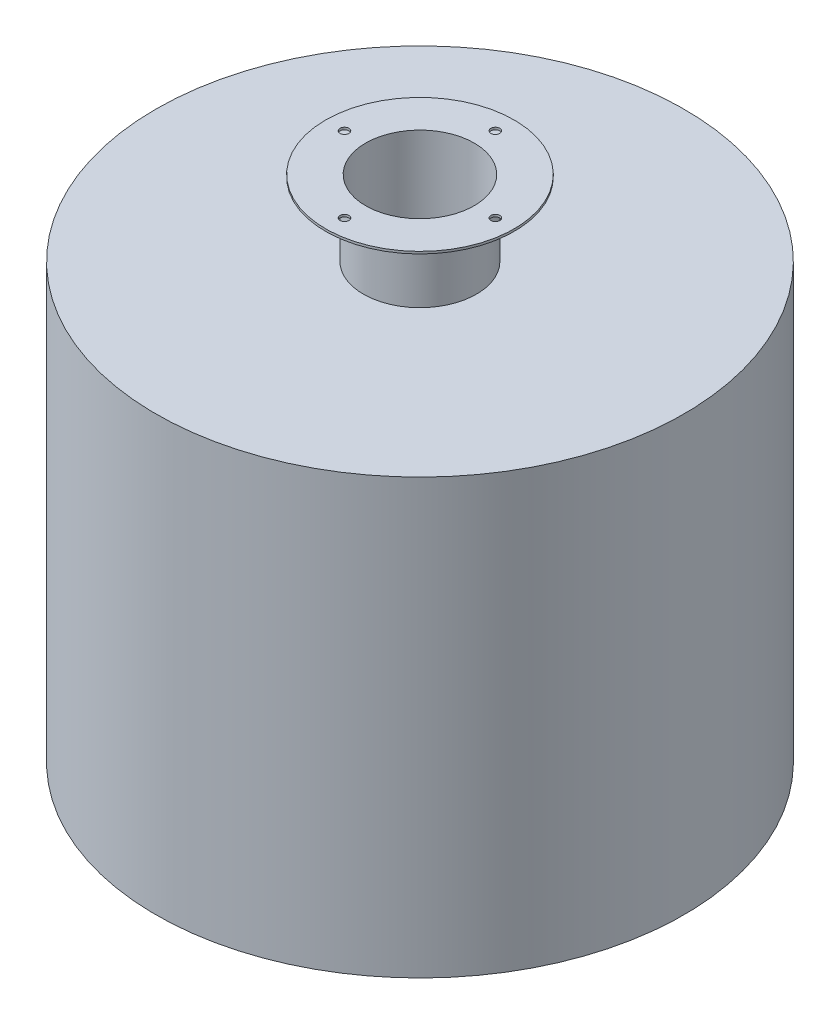
ISO-10303-21;
HEADER;
FILE_DESCRIPTION(('STEP AP214'),'2;1');
FILE_NAME('part.step','',(''),(''),'','','');
FILE_SCHEMA(('AUTOMOTIVE_DESIGN { 1 0 10303 214 1 1 1 1 }'));
ENDSEC;
DATA;
#1=APPLICATION_CONTEXT('core data for automotive mechanical design processes');
#2=APPLICATION_PROTOCOL_DEFINITION('international standard','automotive_design',2000,#1);
#3=PRODUCT_CONTEXT('',#1,'mechanical');
#4=PRODUCT('Part','Part','',(#3));
#5=PRODUCT_RELATED_PRODUCT_CATEGORY('part','',(#4));
#6=PRODUCT_DEFINITION_FORMATION('','',#4);
#7=PRODUCT_DEFINITION_CONTEXT('part definition',#1,'design');
#8=PRODUCT_DEFINITION('design','',#6,#7);
#9=PRODUCT_DEFINITION_SHAPE('','',#8);
#10=(LENGTH_UNIT() NAMED_UNIT(*) SI_UNIT(.MILLI.,.METRE.));
#11=(NAMED_UNIT(*) PLANE_ANGLE_UNIT() SI_UNIT($,.RADIAN.));
#12=(NAMED_UNIT(*) SI_UNIT($,.STERADIAN.) SOLID_ANGLE_UNIT());
#13=UNCERTAINTY_MEASURE_WITH_UNIT(LENGTH_MEASURE(1.E-05),#10,'distance_accuracy_value','');
#14=(GEOMETRIC_REPRESENTATION_CONTEXT(3) GLOBAL_UNCERTAINTY_ASSIGNED_CONTEXT((#13)) GLOBAL_UNIT_ASSIGNED_CONTEXT((#10,
#11,#12)) REPRESENTATION_CONTEXT('',''));
#15=CARTESIAN_POINT('',(0.,0.,0.));
#16=DIRECTION('',(0.,0.,1.));
#17=DIRECTION('',(1.,0.,0.));
#18=AXIS2_PLACEMENT_3D('',#15,#16,#17);
#19=CARTESIAN_POINT('',(0.,0.,0.));
#20=DIRECTION('',(0.,1.,0.));
#21=DIRECTION('',(-1.,0.,0.));
#22=AXIS2_PLACEMENT_3D('',#19,#20,#21);
#23=PLANE('',#22);
#24=CARTESIAN_POINT('',(0.,0.,0.));
#25=DIRECTION('',(0.,1.,0.));
#26=DIRECTION('',(-1.,0.,0.));
#27=AXIS2_PLACEMENT_3D('',#24,#25,#26);
#28=CIRCLE('',#27,177.8);
#29=CARTESIAN_POINT('',(-177.8,0.,0.));
#30=VERTEX_POINT('',#29);
#31=EDGE_CURVE('E10',#30,#30,#28,.T.);
#32=ORIENTED_EDGE('',*,*,#31,.F.);
#33=EDGE_LOOP('',(#32));
#34=FACE_BOUND('',#33,.T.);
#35=ADVANCED_FACE('F40',(#34),#23,.F.);
#36=CARTESIAN_POINT('',(0.,342.9,0.));
#37=DIRECTION('',(0.,1.,0.));
#38=DIRECTION('',(-1.,0.,0.));
#39=AXIS2_PLACEMENT_3D('',#36,#37,#38);
#40=CYLINDRICAL_SURFACE('',#39,177.8);
#41=CARTESIAN_POINT('',(0.,292.1,0.));
#42=DIRECTION('',(0.,1.,0.));
#43=DIRECTION('',(-1.,0.,0.));
#44=AXIS2_PLACEMENT_3D('',#41,#42,#43);
#45=CIRCLE('',#44,177.8);
#46=CARTESIAN_POINT('',(-177.8,292.1,0.));
#47=VERTEX_POINT('',#46);
#48=EDGE_CURVE('E47',#47,#47,#45,.T.);
#49=ORIENTED_EDGE('',*,*,#48,.F.);
#50=EDGE_LOOP('',(#49));
#51=FACE_BOUND('',#50,.T.);
#52=ORIENTED_EDGE('',*,*,#31,.T.);
#53=EDGE_LOOP('',(#52));
#54=FACE_BOUND('',#53,.T.);
#55=ADVANCED_FACE('F162',(#51,#54),#40,.T.);
#56=CARTESIAN_POINT('',(177.8,292.1,0.));
#57=DIRECTION('',(0.,-1.,0.));
#58=DIRECTION('',(1.,0.,0.));
#59=AXIS2_PLACEMENT_3D('',#56,#57,#58);
#60=PLANE('',#59);
#61=CARTESIAN_POINT('',(0.,292.1,0.));
#62=DIRECTION('',(0.,1.,0.));
#63=DIRECTION('',(-1.,0.,0.));
#64=AXIS2_PLACEMENT_3D('',#61,#62,#63);
#65=CIRCLE('',#64,38.1);
#66=CARTESIAN_POINT('',(-38.1,292.1,0.));
#67=VERTEX_POINT('',#66);
#68=EDGE_CURVE('E53',#67,#67,#65,.T.);
#69=ORIENTED_EDGE('',*,*,#68,.F.);
#70=EDGE_LOOP('',(#69));
#71=FACE_BOUND('',#70,.T.);
#72=ORIENTED_EDGE('',*,*,#48,.T.);
#73=EDGE_LOOP('',(#72));
#74=FACE_BOUND('',#73,.T.);
#75=ADVANCED_FACE('F157',(#71,#74),#60,.F.);
#76=CARTESIAN_POINT('',(0.,342.9,0.));
#77=DIRECTION('',(0.,1.,0.));
#78=DIRECTION('',(-1.,0.,0.));
#79=AXIS2_PLACEMENT_3D('',#76,#77,#78);
#80=CYLINDRICAL_SURFACE('',#79,38.1);
#81=CARTESIAN_POINT('',(0.,341.376,0.));
#82=DIRECTION('',(0.,1.,0.));
#83=DIRECTION('',(-1.,0.,0.));
#84=AXIS2_PLACEMENT_3D('',#81,#82,#83);
#85=CIRCLE('',#84,38.1);
#86=CARTESIAN_POINT('',(-38.1,341.376,0.));
#87=VERTEX_POINT('',#86);
#88=EDGE_CURVE('E59',#87,#87,#85,.T.);
#89=ORIENTED_EDGE('',*,*,#88,.F.);
#90=EDGE_LOOP('',(#89));
#91=FACE_BOUND('',#90,.T.);
#92=ORIENTED_EDGE('',*,*,#68,.T.);
#93=EDGE_LOOP('',(#92));
#94=FACE_BOUND('',#93,.T.);
#95=ADVANCED_FACE('F150',(#91,#94),#80,.T.);
#96=CARTESIAN_POINT('',(38.1,341.376,0.));
#97=DIRECTION('',(0.,1.,0.));
#98=DIRECTION('',(-1.,0.,0.));
#99=AXIS2_PLACEMENT_3D('',#96,#97,#98);
#100=PLANE('',#99);
#101=CARTESIAN_POINT('',(-1.76501617226847E-13,341.376,-50.8));
#102=DIRECTION('',(0.,1.,0.));
#103=DIRECTION('',(-1.,0.,0.));
#104=AXIS2_PLACEMENT_3D('',#101,#102,#103);
#105=CIRCLE('',#104,2.999994);
#106=CARTESIAN_POINT('',(-2.99999400000017,341.376,-50.8));
#107=VERTEX_POINT('',#106);
#108=EDGE_CURVE('E97',#107,#107,#105,.F.);
#109=ORIENTED_EDGE('',*,*,#108,.F.);
#110=EDGE_LOOP('',(#109));
#111=FACE_BOUND('',#110,.T.);
#112=CARTESIAN_POINT('',(-50.8,341.376,0.));
#113=DIRECTION('',(0.,1.,0.));
#114=DIRECTION('',(-1.,0.,0.));
#115=AXIS2_PLACEMENT_3D('',#112,#113,#114);
#116=CIRCLE('',#115,2.999994);
#117=CARTESIAN_POINT('',(-53.799994,341.376,0.));
#118=VERTEX_POINT('',#117);
#119=EDGE_CURVE('E107',#118,#118,#116,.F.);
#120=ORIENTED_EDGE('',*,*,#119,.F.);
#121=EDGE_LOOP('',(#120));
#122=FACE_BOUND('',#121,.T.);
#123=CARTESIAN_POINT('',(5.32967390826077E-13,341.376,50.8));
#124=DIRECTION('',(0.,1.,0.));
#125=DIRECTION('',(-1.,0.,0.));
#126=AXIS2_PLACEMENT_3D('',#123,#124,#125);
#127=CIRCLE('',#126,2.999994);
#128=CARTESIAN_POINT('',(-2.99999399999946,341.376,50.8));
#129=VERTEX_POINT('',#128);
#130=EDGE_CURVE('E98',#129,#129,#127,.F.);
#131=ORIENTED_EDGE('',*,*,#130,.F.);
#132=EDGE_LOOP('',(#131));
#133=FACE_BOUND('',#132,.T.);
#134=CARTESIAN_POINT('',(50.8,341.376,0.));
#135=DIRECTION('',(0.,1.,0.));
#136=DIRECTION('',(-1.,0.,0.));
#137=AXIS2_PLACEMENT_3D('',#134,#135,#136);
#138=CIRCLE('',#137,2.999994);
#139=CARTESIAN_POINT('',(47.800006,341.376,0.));
#140=VERTEX_POINT('',#139);
#141=EDGE_CURVE('E79',#140,#140,#138,.F.);
#142=ORIENTED_EDGE('',*,*,#141,.F.);
#143=EDGE_LOOP('',(#142));
#144=FACE_BOUND('',#143,.T.);
#145=CARTESIAN_POINT('',(0.,341.376,0.));
#146=DIRECTION('',(0.,1.,0.));
#147=DIRECTION('',(-1.,0.,0.));
#148=AXIS2_PLACEMENT_3D('',#145,#146,#147);
#149=CIRCLE('',#148,63.5);
#150=CARTESIAN_POINT('',(-63.5,341.376,0.));
#151=VERTEX_POINT('',#150);
#152=EDGE_CURVE('E65',#151,#151,#149,.T.);
#153=ORIENTED_EDGE('',*,*,#152,.F.);
#154=EDGE_LOOP('',(#153));
#155=FACE_BOUND('',#154,.T.);
#156=ORIENTED_EDGE('',*,*,#88,.T.);
#157=EDGE_LOOP('',(#156));
#158=FACE_BOUND('',#157,.T.);
#159=ADVANCED_FACE('F144',(#111,#122,#133,#144,#155,#158),#100,.F.);
#160=CARTESIAN_POINT('',(0.,342.9,0.));
#161=DIRECTION('',(0.,1.,0.));
#162=DIRECTION('',(-1.,0.,0.));
#163=AXIS2_PLACEMENT_3D('',#160,#161,#162);
#164=CYLINDRICAL_SURFACE('',#163,63.5);
#165=CARTESIAN_POINT('',(0.,342.9,0.));
#166=DIRECTION('',(0.,1.,0.));
#167=DIRECTION('',(-1.,0.,0.));
#168=AXIS2_PLACEMENT_3D('',#165,#166,#167);
#169=CIRCLE('',#168,63.5);
#170=CARTESIAN_POINT('',(-63.5,342.9,0.));
#171=VERTEX_POINT('',#170);
#172=EDGE_CURVE('E69',#171,#171,#169,.T.);
#173=ORIENTED_EDGE('',*,*,#172,.F.);
#174=EDGE_LOOP('',(#173));
#175=FACE_BOUND('',#174,.T.);
#176=ORIENTED_EDGE('',*,*,#152,.T.);
#177=EDGE_LOOP('',(#176));
#178=FACE_BOUND('',#177,.T.);
#179=ADVANCED_FACE('F130',(#175,#178),#164,.T.);
#180=CARTESIAN_POINT('',(63.5,342.9,0.));
#181=DIRECTION('',(0.,-1.,0.));
#182=DIRECTION('',(1.,0.,0.));
#183=AXIS2_PLACEMENT_3D('',#180,#181,#182);
#184=PLANE('',#183);
#185=CARTESIAN_POINT('',(-1.76497752785837E-13,342.9,-50.8));
#186=DIRECTION('',(0.,1.,0.));
#187=DIRECTION('',(0.,0.,1.));
#188=AXIS2_PLACEMENT_3D('',#185,#186,#187);
#189=CIRCLE('',#188,2.999994);
#190=CARTESIAN_POINT('',(-1.66023329718195E-13,342.9,-47.800006));
#191=VERTEX_POINT('',#190);
#192=EDGE_CURVE('E111',#191,#191,#189,.T.);
#193=ORIENTED_EDGE('',*,*,#192,.F.);
#194=EDGE_LOOP('',(#193));
#195=FACE_BOUND('',#194,.T.);
#196=CARTESIAN_POINT('',(-50.8,342.9,0.));
#197=DIRECTION('',(0.,1.,0.));
#198=DIRECTION('',(1.,0.,0.));
#199=AXIS2_PLACEMENT_3D('',#196,#197,#198);
#200=CIRCLE('',#199,2.999994);
#201=CARTESIAN_POINT('',(-47.800006,342.9,0.));
#202=VERTEX_POINT('',#201);
#203=EDGE_CURVE('E102',#202,#202,#200,.T.);
#204=ORIENTED_EDGE('',*,*,#203,.F.);
#205=EDGE_LOOP('',(#204));
#206=FACE_BOUND('',#205,.T.);
#207=CARTESIAN_POINT('',(5.32971255267088E-13,342.9,50.8));
#208=DIRECTION('',(0.,1.,0.));
#209=DIRECTION('',(0.,0.,-1.));
#210=AXIS2_PLACEMENT_3D('',#207,#208,#209);
#211=CIRCLE('',#210,2.999994);
#212=CARTESIAN_POINT('',(5.01547986064164E-13,342.9,47.800006));
#213=VERTEX_POINT('',#212);
#214=EDGE_CURVE('E103',#213,#213,#211,.T.);
#215=ORIENTED_EDGE('',*,*,#214,.F.);
#216=EDGE_LOOP('',(#215));
#217=FACE_BOUND('',#216,.T.);
#218=CARTESIAN_POINT('',(50.8,342.9,0.));
#219=DIRECTION('',(0.,1.,0.));
#220=DIRECTION('',(-1.,0.,0.));
#221=AXIS2_PLACEMENT_3D('',#218,#219,#220);
#222=CIRCLE('',#221,2.999994);
#223=CARTESIAN_POINT('',(47.800006,342.9,0.));
#224=VERTEX_POINT('',#223);
#225=EDGE_CURVE('E93',#224,#224,#222,.T.);
#226=ORIENTED_EDGE('',*,*,#225,.F.);
#227=EDGE_LOOP('',(#226));
#228=FACE_BOUND('',#227,.T.);
#229=CARTESIAN_POINT('',(0.,342.9,0.));
#230=DIRECTION('',(0.,1.,0.));
#231=DIRECTION('',(-1.,0.,0.));
#232=AXIS2_PLACEMENT_3D('',#229,#230,#231);
#233=CIRCLE('',#232,36.576);
#234=CARTESIAN_POINT('',(-36.576,342.9,0.));
#235=VERTEX_POINT('',#234);
#236=EDGE_CURVE('E74',#235,#235,#233,.T.);
#237=ORIENTED_EDGE('',*,*,#236,.F.);
#238=EDGE_LOOP('',(#237));
#239=FACE_BOUND('',#238,.T.);
#240=ORIENTED_EDGE('',*,*,#172,.T.);
#241=EDGE_LOOP('',(#240));
#242=FACE_BOUND('',#241,.T.);
#243=ADVANCED_FACE('F126',(#195,#206,#217,#228,#239,#242),#184,.F.);
#244=CARTESIAN_POINT('',(0.,1.524,0.));
#245=DIRECTION('',(0.,1.,0.));
#246=DIRECTION('',(-1.,0.,0.));
#247=AXIS2_PLACEMENT_3D('',#244,#245,#246);
#248=PLANE('',#247);
#249=CARTESIAN_POINT('',(0.,1.52400000000003,0.));
#250=DIRECTION('',(0.,1.,0.));
#251=DIRECTION('',(-1.,0.,0.));
#252=AXIS2_PLACEMENT_3D('',#249,#250,#251);
#253=CIRCLE('',#252,176.276);
#254=CARTESIAN_POINT('',(-176.276,1.52400000000003,0.));
#255=VERTEX_POINT('',#254);
#256=EDGE_CURVE('E73',#255,#255,#253,.T.);
#257=ORIENTED_EDGE('',*,*,#256,.T.);
#258=EDGE_LOOP('',(#257));
#259=FACE_BOUND('',#258,.T.);
#260=ADVANCED_FACE('F129',(#259),#248,.T.);
#261=CARTESIAN_POINT('',(0.,342.9,0.));
#262=DIRECTION('',(0.,1.,0.));
#263=DIRECTION('',(-1.,0.,0.));
#264=AXIS2_PLACEMENT_3D('',#261,#262,#263);
#265=CYLINDRICAL_SURFACE('',#264,176.276);
#266=CARTESIAN_POINT('',(0.,290.576,0.));
#267=DIRECTION('',(0.,-1.,0.));
#268=DIRECTION('',(1.,0.,0.));
#269=AXIS2_PLACEMENT_3D('',#266,#267,#268);
#270=CIRCLE('',#269,176.276);
#271=CARTESIAN_POINT('',(176.276,290.576,0.));
#272=VERTEX_POINT('',#271);
#273=EDGE_CURVE('E83',#272,#272,#270,.F.);
#274=ORIENTED_EDGE('',*,*,#273,.T.);
#275=EDGE_LOOP('',(#274));
#276=FACE_BOUND('',#275,.T.);
#277=ORIENTED_EDGE('',*,*,#256,.F.);
#278=EDGE_LOOP('',(#277));
#279=FACE_BOUND('',#278,.T.);
#280=ADVANCED_FACE('F207',(#276,#279),#265,.F.);
#281=CARTESIAN_POINT('',(177.8,290.576,0.));
#282=DIRECTION('',(0.,-1.,0.));
#283=DIRECTION('',(1.,0.,0.));
#284=AXIS2_PLACEMENT_3D('',#281,#282,#283);
#285=PLANE('',#284);
#286=CARTESIAN_POINT('',(0.,290.576,0.));
#287=DIRECTION('',(0.,-1.,0.));
#288=DIRECTION('',(1.,0.,0.));
#289=AXIS2_PLACEMENT_3D('',#286,#287,#288);
#290=CIRCLE('',#289,36.576);
#291=CARTESIAN_POINT('',(36.576,290.576,0.));
#292=VERTEX_POINT('',#291);
#293=EDGE_CURVE('E78',#292,#292,#290,.F.);
#294=ORIENTED_EDGE('',*,*,#293,.T.);
#295=EDGE_LOOP('',(#294));
#296=FACE_BOUND('',#295,.T.);
#297=ORIENTED_EDGE('',*,*,#273,.F.);
#298=EDGE_LOOP('',(#297));
#299=FACE_BOUND('',#298,.T.);
#300=ADVANCED_FACE('F218',(#296,#299),#285,.T.);
#301=CARTESIAN_POINT('',(0.,342.9,0.));
#302=DIRECTION('',(0.,1.,0.));
#303=DIRECTION('',(-1.,0.,0.));
#304=AXIS2_PLACEMENT_3D('',#301,#302,#303);
#305=CYLINDRICAL_SURFACE('',#304,36.576);
#306=ORIENTED_EDGE('',*,*,#236,.T.);
#307=EDGE_LOOP('',(#306));
#308=FACE_BOUND('',#307,.T.);
#309=ORIENTED_EDGE('',*,*,#293,.F.);
#310=EDGE_LOOP('',(#309));
#311=FACE_BOUND('',#310,.T.);
#312=ADVANCED_FACE('F229',(#308,#311),#305,.F.);
#313=CARTESIAN_POINT('',(50.8,-0.000999999999973245,0.));
#314=DIRECTION('',(0.,1.,0.));
#315=DIRECTION('',(-1.,0.,0.));
#316=AXIS2_PLACEMENT_3D('',#313,#314,#315);
#317=CYLINDRICAL_SURFACE('',#316,2.999994);
#318=ORIENTED_EDGE('',*,*,#225,.T.);
#319=EDGE_LOOP('',(#318));
#320=FACE_BOUND('',#319,.T.);
#321=ORIENTED_EDGE('',*,*,#141,.T.);
#322=EDGE_LOOP('',(#321));
#323=FACE_BOUND('',#322,.T.);
#324=ADVANCED_FACE('F240',(#320,#323),#317,.F.);
#325=CARTESIAN_POINT('',(5.32101753503971E-13,-0.000999999999973245,50.8));
#326=DIRECTION('',(0.,1.,0.));
#327=DIRECTION('',(0.,0.,1.));
#328=AXIS2_PLACEMENT_3D('',#325,#326,#327);
#329=CYLINDRICAL_SURFACE('',#328,2.999994);
#330=ORIENTED_EDGE('',*,*,#214,.T.);
#331=EDGE_LOOP('',(#330));
#332=FACE_BOUND('',#331,.T.);
#333=ORIENTED_EDGE('',*,*,#130,.T.);
#334=EDGE_LOOP('',(#333));
#335=FACE_BOUND('',#334,.T.);
#336=ADVANCED_FACE('F251',(#332,#335),#329,.F.);
#337=CARTESIAN_POINT('',(-50.8,-0.000999999999973245,0.));
#338=DIRECTION('',(0.,1.,0.));
#339=DIRECTION('',(-1.,0.,0.));
#340=AXIS2_PLACEMENT_3D('',#337,#338,#339);
#341=CYLINDRICAL_SURFACE('',#340,2.999994);
#342=ORIENTED_EDGE('',*,*,#203,.T.);
#343=EDGE_LOOP('',(#342));
#344=FACE_BOUND('',#343,.T.);
#345=ORIENTED_EDGE('',*,*,#119,.T.);
#346=EDGE_LOOP('',(#345));
#347=FACE_BOUND('',#346,.T.);
#348=ADVANCED_FACE('F274',(#344,#347),#341,.F.);
#349=CARTESIAN_POINT('',(-1.77367254548954E-13,-0.000999999999973245,-50.8));
#350=DIRECTION('',(0.,1.,0.));
#351=DIRECTION('',(0.,0.,1.));
#352=AXIS2_PLACEMENT_3D('',#349,#350,#351);
#353=CYLINDRICAL_SURFACE('',#352,2.999994);
#354=ORIENTED_EDGE('',*,*,#192,.T.);
#355=EDGE_LOOP('',(#354));
#356=FACE_BOUND('',#355,.T.);
#357=ORIENTED_EDGE('',*,*,#108,.T.);
#358=EDGE_LOOP('',(#357));
#359=FACE_BOUND('',#358,.T.);
#360=ADVANCED_FACE('F123',(#356,#359),#353,.F.);
#361=CLOSED_SHELL('',(#35,#55,#75,#95,#159,#179,#243,#260,#280,#300,#312,#324,#336,#348,#360));
#362=MANIFOLD_SOLID_BREP('B2',#361);
#363=ADVANCED_BREP_SHAPE_REPRESENTATION('',(#18,#362),#14);
#364=SHAPE_DEFINITION_REPRESENTATION(#9,#363);
ENDSEC;
END-ISO-10303-21;
